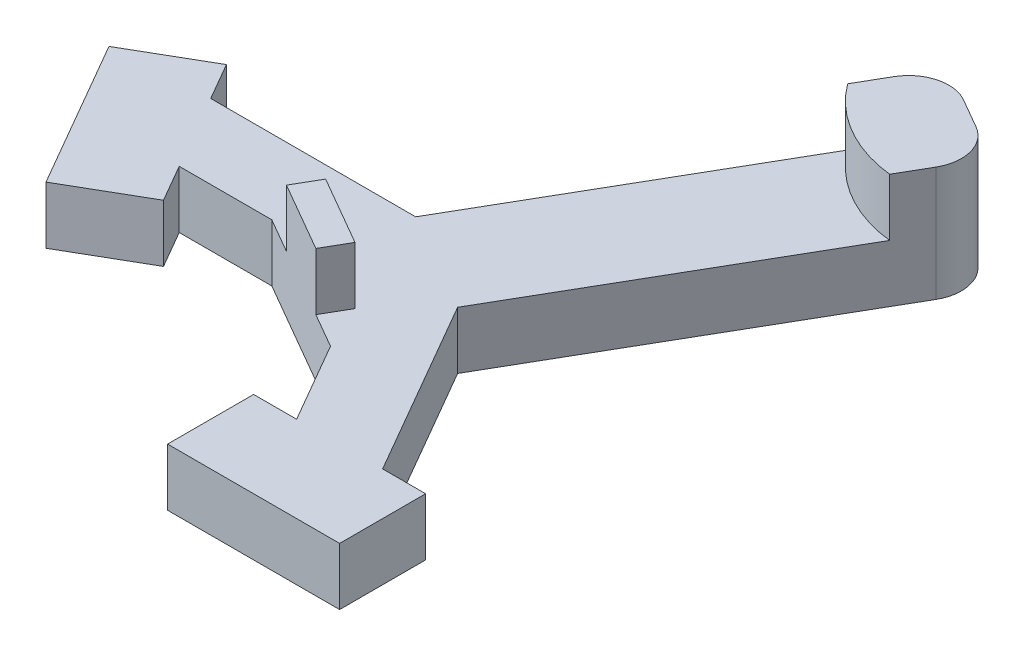
ISO-10303-21;
HEADER;
FILE_DESCRIPTION(('STEP AP214'),'2;1');
FILE_NAME('part.step','',(''),(''),'','','');
FILE_SCHEMA(('AUTOMOTIVE_DESIGN { 1 0 10303 214 1 1 1 1 }'));
ENDSEC;
DATA;
#1=APPLICATION_CONTEXT('core data for automotive mechanical design processes');
#2=APPLICATION_PROTOCOL_DEFINITION('international standard','automotive_design',2000,#1);
#3=PRODUCT_CONTEXT('',#1,'mechanical');
#4=PRODUCT('Part','Part','',(#3));
#5=PRODUCT_RELATED_PRODUCT_CATEGORY('part','',(#4));
#6=PRODUCT_DEFINITION_FORMATION('','',#4);
#7=PRODUCT_DEFINITION_CONTEXT('part definition',#1,'design');
#8=PRODUCT_DEFINITION('design','',#6,#7);
#9=PRODUCT_DEFINITION_SHAPE('','',#8);
#10=(LENGTH_UNIT() NAMED_UNIT(*) SI_UNIT(.MILLI.,.METRE.));
#11=(NAMED_UNIT(*) PLANE_ANGLE_UNIT() SI_UNIT($,.RADIAN.));
#12=(NAMED_UNIT(*) SI_UNIT($,.STERADIAN.) SOLID_ANGLE_UNIT());
#13=UNCERTAINTY_MEASURE_WITH_UNIT(LENGTH_MEASURE(1.E-05),#10,'distance_accuracy_value','');
#14=(GEOMETRIC_REPRESENTATION_CONTEXT(3) GLOBAL_UNCERTAINTY_ASSIGNED_CONTEXT((#13)) GLOBAL_UNIT_ASSIGNED_CONTEXT((#10,
#11,#12)) REPRESENTATION_CONTEXT('',''));
#15=CARTESIAN_POINT('',(0.,0.,0.));
#16=DIRECTION('',(0.,0.,1.));
#17=DIRECTION('',(1.,0.,0.));
#18=AXIS2_PLACEMENT_3D('',#15,#16,#17);
#19=CARTESIAN_POINT('',(0.,10.,0.));
#20=DIRECTION('',(0.,1.,0.));
#21=DIRECTION('',(0.,0.,1.));
#22=AXIS2_PLACEMENT_3D('',#19,#20,#21);
#23=PLANE('',#22);
#24=DIRECTION('',(-0.866025403784439,0.,-0.499999999999999));
#25=VECTOR('',#24,1.);
#26=CARTESIAN_POINT('',(40.879214965014,10.,-56.8048772929341));
#27=LINE('',#26,#25);
#28=CARTESIAN_POINT('',(40.879214965014,10.,-56.8048772929341));
#29=VERTEX_POINT('',#28);
#30=CARTESIAN_POINT('',(28.7548593120319,10.,-63.8048772929341));
#31=VERTEX_POINT('',#30);
#32=EDGE_CURVE('E494',#29,#31,#27,.T.);
#33=ORIENTED_EDGE('',*,*,#32,.F.);
#34=DIRECTION('',(0.499999999999999,0.,-0.866025403784439));
#35=VECTOR('',#34,1.);
#36=CARTESIAN_POINT('',(38.3792149650141,10.,-52.4747502740119));
#37=LINE('',#36,#35);
#38=CARTESIAN_POINT('',(38.3792149650141,10.,-52.4747502740119));
#39=VERTEX_POINT('',#38);
#40=EDGE_CURVE('E491',#39,#29,#37,.T.);
#41=ORIENTED_EDGE('',*,*,#40,.F.);
#42=DIRECTION('',(0.86602540378444,0.,0.499999999999998));
#43=VECTOR('',#42,1.);
#44=CARTESIAN_POINT('',(44.4268148554087,10.,-48.9831668493415));
#45=LINE('',#44,#43);
#46=CARTESIAN_POINT('',(44.4268148554087,10.,-48.9831668493415));
#47=VERTEX_POINT('',#46);
#48=EDGE_CURVE('E236',#39,#47,#45,.T.);
#49=ORIENTED_EDGE('',*,*,#48,.T.);
#50=DIRECTION('',(0.5,0.,0.866025403784439));
#51=VECTOR('',#50,1.);
#52=CARTESIAN_POINT('',(44.4268148554087,10.,-48.9831668493415));
#53=LINE('',#52,#51);
#54=CARTESIAN_POINT('',(52.4999999999995,10.,-35.));
#55=VERTEX_POINT('',#54);
#56=EDGE_CURVE('E275',#47,#55,#53,.T.);
#57=ORIENTED_EDGE('',*,*,#56,.T.);
#58=DIRECTION('',(-1.,0.,0.));
#59=VECTOR('',#58,1.);
#60=CARTESIAN_POINT('',(52.4999999999995,10.,-35.));
#61=LINE('',#60,#59);
#62=CARTESIAN_POINT('',(44.9999999999999,10.,-35.));
#63=VERTEX_POINT('',#62);
#64=EDGE_CURVE('E277',#55,#63,#61,.T.);
#65=ORIENTED_EDGE('',*,*,#64,.T.);
#66=DIRECTION('',(0.,0.,1.));
#67=VECTOR('',#66,1.);
#68=CARTESIAN_POINT('',(44.9999999999999,10.,-35.));
#69=LINE('',#68,#67);
#70=CARTESIAN_POINT('',(44.9999999999999,10.,-20.));
#71=VERTEX_POINT('',#70);
#72=EDGE_CURVE('E279',#63,#71,#69,.T.);
#73=ORIENTED_EDGE('',*,*,#72,.T.);
#74=DIRECTION('',(1.,0.,0.));
#75=VECTOR('',#74,1.);
#76=CARTESIAN_POINT('',(44.9999999999999,10.,-20.));
#77=LINE('',#76,#75);
#78=CARTESIAN_POINT('',(74.9999999999999,10.,-20.));
#79=VERTEX_POINT('',#78);
#80=EDGE_CURVE('E281',#71,#79,#77,.T.);
#81=ORIENTED_EDGE('',*,*,#80,.T.);
#82=DIRECTION('',(0.,0.,-1.));
#83=VECTOR('',#82,1.);
#84=CARTESIAN_POINT('',(74.9999999999999,10.,-20.));
#85=LINE('',#84,#83);
#86=CARTESIAN_POINT('',(74.9999999999999,10.,-35.));
#87=VERTEX_POINT('',#86);
#88=EDGE_CURVE('E283',#79,#87,#85,.T.);
#89=ORIENTED_EDGE('',*,*,#88,.T.);
#90=DIRECTION('',(-1.,0.,0.));
#91=VECTOR('',#90,1.);
#92=CARTESIAN_POINT('',(74.9999999999999,10.,-35.));
#93=LINE('',#92,#91);
#94=CARTESIAN_POINT('',(67.4999999999996,10.,-35.));
#95=VERTEX_POINT('',#94);
#96=EDGE_CURVE('E285',#87,#95,#93,.T.);
#97=ORIENTED_EDGE('',*,*,#96,.T.);
#98=DIRECTION('',(-0.499999999999999,0.,-0.866025403784439));
#99=VECTOR('',#98,1.);
#100=CARTESIAN_POINT('',(67.4999999999996,10.,-35.));
#101=LINE('',#100,#99);
#102=CARTESIAN_POINT('',(49.6271324027145,10.,-65.9567147554494));
#103=VERTEX_POINT('',#102);
#104=EDGE_CURVE('E287',#95,#103,#101,.T.);
#105=ORIENTED_EDGE('',*,*,#104,.T.);
#106=DIRECTION('',(0.499999999999998,0.,-0.86602540378444));
#107=VECTOR('',#106,1.);
#108=CARTESIAN_POINT('',(49.6271324027145,10.,-65.9567147554494));
#109=LINE('',#108,#107);
#110=CARTESIAN_POINT('',(77.2038148004545,10.,-113.720929772526));
#111=VERTEX_POINT('',#110);
#112=EDGE_CURVE('E289',#103,#111,#109,.T.);
#113=ORIENTED_EDGE('',*,*,#112,.T.);
#114=CARTESIAN_POINT('',(80.,10.,-138.56406460551));
#115=DIRECTION('',(0.,1.,0.));
#116=DIRECTION('',(0.,0.,1.));
#117=AXIS2_PLACEMENT_3D('',#114,#115,#116);
#118=CIRCLE('',#117,25.);
#119=CARTESIAN_POINT('',(59.8833067247658,10.,-123.720929772526));
#120=VERTEX_POINT('',#119);
#121=EDGE_CURVE('E237',#120,#111,#118,.T.);
#122=ORIENTED_EDGE('',*,*,#121,.F.);
#123=DIRECTION('',(-0.499999999999997,0.,0.86602540378444));
#124=VECTOR('',#123,1.);
#125=CARTESIAN_POINT('',(66.3397459621553,10.,-134.903810567666));
#126=LINE('',#125,#124);
#127=CARTESIAN_POINT('',(32.3066243270257,10.,-75.9567147554493));
#128=VERTEX_POINT('',#127);
#129=EDGE_CURVE('E291',#120,#128,#126,.T.);
#130=ORIENTED_EDGE('',*,*,#129,.T.);
#131=DIRECTION('',(-1.,0.,0.));
#132=VECTOR('',#131,1.);
#133=CARTESIAN_POINT('',(32.3066243270257,10.,-75.9567147554493));
#134=LINE('',#133,#132);
#135=CARTESIAN_POINT('',(-3.43911086754488,10.,-75.9567147554494));
#136=VERTEX_POINT('',#135);
#137=EDGE_CURVE('E293',#128,#136,#134,.T.);
#138=ORIENTED_EDGE('',*,*,#137,.T.);
#139=DIRECTION('',(-0.5,0.,-0.866025403784438));
#140=VECTOR('',#139,1.);
#141=CARTESIAN_POINT('',(-3.43911086754488,10.,-75.9567147554494));
#142=LINE('',#141,#140);
#143=CARTESIAN_POINT('',(-7.18911086754487,10.,-82.4519052838326));
#144=VERTEX_POINT('',#143);
#145=EDGE_CURVE('E295',#136,#144,#142,.T.);
#146=ORIENTED_EDGE('',*,*,#145,.T.);
#147=DIRECTION('',(-0.866025403784439,0.,0.5));
#148=VECTOR('',#147,1.);
#149=CARTESIAN_POINT('',(-7.18911086754487,10.,-82.4519052838326));
#150=LINE('',#149,#148);
#151=CARTESIAN_POINT('',(-20.1794919243113,10.,-74.9519052838327));
#152=VERTEX_POINT('',#151);
#153=EDGE_CURVE('E260',#144,#152,#150,.T.);
#154=ORIENTED_EDGE('',*,*,#153,.T.);
#155=DIRECTION('',(0.5,0.,0.866025403784439));
#156=VECTOR('',#155,1.);
#157=CARTESIAN_POINT('',(-20.1794919243113,10.,-74.9519052838327));
#158=LINE('',#157,#156);
#159=CARTESIAN_POINT('',(-5.17949192431135,10.,-48.9711431702996));
#160=VERTEX_POINT('',#159);
#161=EDGE_CURVE('E263',#152,#160,#158,.T.);
#162=ORIENTED_EDGE('',*,*,#161,.T.);
#163=DIRECTION('',(0.866025403784439,0.,-0.499999999999999));
#164=VECTOR('',#163,1.);
#165=CARTESIAN_POINT('',(-5.17949192431135,10.,-48.9711431702996));
#166=LINE('',#165,#164);
#167=CARTESIAN_POINT('',(7.81088913245523,10.,-56.4711431702995));
#168=VERTEX_POINT('',#167);
#169=EDGE_CURVE('E266',#160,#168,#166,.T.);
#170=ORIENTED_EDGE('',*,*,#169,.T.);
#171=DIRECTION('',(-0.500000000000015,0.,-0.86602540378443));
#172=VECTOR('',#171,1.);
#173=CARTESIAN_POINT('',(7.81088913245523,10.,-56.4711431702995));
#174=LINE('',#173,#172);
#175=CARTESIAN_POINT('',(4.06088913245512,10.,-62.9663336986828));
#176=VERTEX_POINT('',#175);
#177=EDGE_CURVE('E268',#168,#176,#174,.T.);
#178=ORIENTED_EDGE('',*,*,#177,.T.);
#179=DIRECTION('',(1.,0.,0.));
#180=VECTOR('',#179,1.);
#181=CARTESIAN_POINT('',(4.06088913245512,10.,-62.9663336986828));
#182=LINE('',#181,#180);
#183=CARTESIAN_POINT('',(20.2072594216367,10.,-62.9663336986828));
#184=VERTEX_POINT('',#183);
#185=EDGE_CURVE('E270',#176,#184,#182,.T.);
#186=ORIENTED_EDGE('',*,*,#185,.T.);
#187=CARTESIAN_POINT('',(26.2548593120319,10.,-59.4747502740119));
#188=VERTEX_POINT('',#187);
#189=EDGE_CURVE('E272',#184,#188,#45,.T.);
#190=ORIENTED_EDGE('',*,*,#189,.T.);
#191=DIRECTION('',(-0.5,0.,0.866025403784439));
#192=VECTOR('',#191,1.);
#193=CARTESIAN_POINT('',(28.7548593120319,10.,-63.8048772929341));
#194=LINE('',#193,#192);
#195=EDGE_CURVE('E231',#31,#188,#194,.T.);
#196=ORIENTED_EDGE('',*,*,#195,.F.);
#197=EDGE_LOOP('',(#33,#41,#49,#57,#65,#73,#81,#89,#97,#105,#113,#122,#130,#138,#146,#154,#162,
#170,#178,#186,#190,#196));
#198=FACE_BOUND('',#197,.T.);
#199=ADVANCED_FACE('F37',(#198),#23,.T.);
#200=CARTESIAN_POINT('',(-7.18911086754487,10.,-82.4519052838326));
#201=DIRECTION('',(0.5,0.,0.866025403784439));
#202=DIRECTION('',(0.866025403784439,0.,-0.5));
#203=AXIS2_PLACEMENT_3D('',#200,#201,#202);
#204=PLANE('',#203);
#205=DIRECTION('',(-0.866025403784439,0.,0.5));
#206=VECTOR('',#205,1.);
#207=CARTESIAN_POINT('',(-7.18911086754487,0.,-82.4519052838326));
#208=LINE('',#207,#206);
#209=CARTESIAN_POINT('',(-7.18911086754487,0.,-82.4519052838326));
#210=VERTEX_POINT('',#209);
#211=CARTESIAN_POINT('',(-20.1794919243113,0.,-74.9519052838327));
#212=VERTEX_POINT('',#211);
#213=EDGE_CURVE('E259',#210,#212,#208,.T.);
#214=ORIENTED_EDGE('',*,*,#213,.T.);
#215=DIRECTION('',(0.,-1.,0.));
#216=VECTOR('',#215,1.);
#217=CARTESIAN_POINT('',(-20.1794919243113,10.,-74.9519052838327));
#218=LINE('',#217,#216);
#219=EDGE_CURVE('E377',#152,#212,#218,.T.);
#220=ORIENTED_EDGE('',*,*,#219,.F.);
#221=ORIENTED_EDGE('',*,*,#153,.F.);
#222=DIRECTION('',(0.,-1.,0.));
#223=VECTOR('',#222,1.);
#224=CARTESIAN_POINT('',(-7.18911086754487,10.,-82.4519052838326));
#225=LINE('',#224,#223);
#226=EDGE_CURVE('E297',#144,#210,#225,.T.);
#227=ORIENTED_EDGE('',*,*,#226,.T.);
#228=EDGE_LOOP('',(#214,#220,#221,#227));
#229=FACE_BOUND('',#228,.T.);
#230=ADVANCED_FACE('F475',(#229),#204,.F.);
#231=CARTESIAN_POINT('',(-20.1794919243113,10.,-74.9519052838327));
#232=DIRECTION('',(0.866025403784438,0.,-0.5));
#233=DIRECTION('',(-0.5,0.,-0.866025403784439));
#234=AXIS2_PLACEMENT_3D('',#231,#232,#233);
#235=PLANE('',#234);
#236=DIRECTION('',(0.5,0.,0.866025403784439));
#237=VECTOR('',#236,1.);
#238=CARTESIAN_POINT('',(-20.1794919243113,0.,-74.9519052838327));
#239=LINE('',#238,#237);
#240=CARTESIAN_POINT('',(-5.17949192431135,0.,-48.9711431702996));
#241=VERTEX_POINT('',#240);
#242=EDGE_CURVE('E300',#212,#241,#239,.T.);
#243=ORIENTED_EDGE('',*,*,#242,.T.);
#244=DIRECTION('',(0.,-1.,0.));
#245=VECTOR('',#244,1.);
#246=CARTESIAN_POINT('',(-5.17949192431135,10.,-48.9711431702996));
#247=LINE('',#246,#245);
#248=EDGE_CURVE('E374',#160,#241,#247,.T.);
#249=ORIENTED_EDGE('',*,*,#248,.F.);
#250=ORIENTED_EDGE('',*,*,#161,.F.);
#251=ORIENTED_EDGE('',*,*,#219,.T.);
#252=EDGE_LOOP('',(#243,#249,#250,#251));
#253=FACE_BOUND('',#252,.T.);
#254=ADVANCED_FACE('F471',(#253),#235,.F.);
#255=CARTESIAN_POINT('',(-5.17949192431135,10.,-48.9711431702996));
#256=DIRECTION('',(-0.5,0.,-0.866025403784439));
#257=DIRECTION('',(-0.866025403784439,0.,0.5));
#258=AXIS2_PLACEMENT_3D('',#255,#256,#257);
#259=PLANE('',#258);
#260=DIRECTION('',(0.866025403784439,0.,-0.499999999999999));
#261=VECTOR('',#260,1.);
#262=CARTESIAN_POINT('',(-5.17949192431135,0.,-48.9711431702996));
#263=LINE('',#262,#261);
#264=CARTESIAN_POINT('',(7.81088913245523,0.,-56.4711431702995));
#265=VERTEX_POINT('',#264);
#266=EDGE_CURVE('E302',#241,#265,#263,.T.);
#267=ORIENTED_EDGE('',*,*,#266,.T.);
#268=DIRECTION('',(0.,-1.,0.));
#269=VECTOR('',#268,1.);
#270=CARTESIAN_POINT('',(7.81088913245523,10.,-56.4711431702995));
#271=LINE('',#270,#269);
#272=EDGE_CURVE('E371',#168,#265,#271,.T.);
#273=ORIENTED_EDGE('',*,*,#272,.F.);
#274=ORIENTED_EDGE('',*,*,#169,.F.);
#275=ORIENTED_EDGE('',*,*,#248,.T.);
#276=EDGE_LOOP('',(#267,#273,#274,#275));
#277=FACE_BOUND('',#276,.T.);
#278=ADVANCED_FACE('F467',(#277),#259,.F.);
#279=CARTESIAN_POINT('',(7.81088913245523,10.,-56.4711431702995));
#280=DIRECTION('',(-0.86602540378443,0.,0.500000000000015));
#281=DIRECTION('',(0.500000000000015,0.,0.86602540378443));
#282=AXIS2_PLACEMENT_3D('',#279,#280,#281);
#283=PLANE('',#282);
#284=DIRECTION('',(-0.500000000000015,0.,-0.86602540378443));
#285=VECTOR('',#284,1.);
#286=CARTESIAN_POINT('',(7.81088913245523,0.,-56.4711431702995));
#287=LINE('',#286,#285);
#288=CARTESIAN_POINT('',(4.06088913245512,0.,-62.9663336986828));
#289=VERTEX_POINT('',#288);
#290=EDGE_CURVE('E304',#265,#289,#287,.T.);
#291=ORIENTED_EDGE('',*,*,#290,.T.);
#292=DIRECTION('',(0.,-1.,0.));
#293=VECTOR('',#292,1.);
#294=CARTESIAN_POINT('',(4.06088913245512,10.,-62.9663336986828));
#295=LINE('',#294,#293);
#296=EDGE_CURVE('E368',#176,#289,#295,.T.);
#297=ORIENTED_EDGE('',*,*,#296,.F.);
#298=ORIENTED_EDGE('',*,*,#177,.F.);
#299=ORIENTED_EDGE('',*,*,#272,.T.);
#300=EDGE_LOOP('',(#291,#297,#298,#299));
#301=FACE_BOUND('',#300,.T.);
#302=ADVANCED_FACE('F462',(#301),#283,.F.);
#303=CARTESIAN_POINT('',(4.06088913245512,10.,-62.9663336986828));
#304=DIRECTION('',(0.,0.,-1.));
#305=DIRECTION('',(-1.,0.,0.));
#306=AXIS2_PLACEMENT_3D('',#303,#304,#305);
#307=PLANE('',#306);
#308=DIRECTION('',(1.,0.,0.));
#309=VECTOR('',#308,1.);
#310=CARTESIAN_POINT('',(4.06088913245512,0.,-62.9663336986828));
#311=LINE('',#310,#309);
#312=CARTESIAN_POINT('',(20.2072594216367,0.,-62.9663336986828));
#313=VERTEX_POINT('',#312);
#314=EDGE_CURVE('E306',#289,#313,#311,.T.);
#315=ORIENTED_EDGE('',*,*,#314,.T.);
#316=DIRECTION('',(0.,-1.,0.));
#317=VECTOR('',#316,1.);
#318=CARTESIAN_POINT('',(20.2072594216367,10.,-62.9663336986828));
#319=LINE('',#318,#317);
#320=EDGE_CURVE('E365',#184,#313,#319,.T.);
#321=ORIENTED_EDGE('',*,*,#320,.F.);
#322=ORIENTED_EDGE('',*,*,#185,.F.);
#323=ORIENTED_EDGE('',*,*,#296,.T.);
#324=EDGE_LOOP('',(#315,#321,#322,#323));
#325=FACE_BOUND('',#324,.T.);
#326=ADVANCED_FACE('F458',(#325),#307,.F.);
#327=CARTESIAN_POINT('',(44.4268148554087,10.,-48.9831668493415));
#328=DIRECTION('',(0.499999999999998,0.,-0.86602540378444));
#329=DIRECTION('',(-0.86602540378444,0.,-0.499999999999998));
#330=AXIS2_PLACEMENT_3D('',#327,#328,#329);
#331=PLANE('',#330);
#332=DIRECTION('',(0.86602540378444,0.,0.499999999999998));
#333=VECTOR('',#332,1.);
#334=CARTESIAN_POINT('',(44.4268148554087,0.,-48.9831668493415));
#335=LINE('',#334,#333);
#336=CARTESIAN_POINT('',(44.4268148554087,0.,-48.9831668493415));
#337=VERTEX_POINT('',#336);
#338=EDGE_CURVE('E308',#313,#337,#335,.T.);
#339=ORIENTED_EDGE('',*,*,#338,.T.);
#340=DIRECTION('',(0.,-1.,0.));
#341=VECTOR('',#340,1.);
#342=CARTESIAN_POINT('',(44.4268148554087,10.,-48.9831668493415));
#343=LINE('',#342,#341);
#344=EDGE_CURVE('E362',#47,#337,#343,.T.);
#345=ORIENTED_EDGE('',*,*,#344,.F.);
#346=ORIENTED_EDGE('',*,*,#48,.F.);
#347=DIRECTION('',(0.,-1.,0.));
#348=VECTOR('',#347,1.);
#349=CARTESIAN_POINT('',(38.3792149650141,20.,-52.4747502740119));
#350=LINE('',#349,#348);
#351=CARTESIAN_POINT('',(38.3792149650141,20.,-52.4747502740119));
#352=VERTEX_POINT('',#351);
#353=EDGE_CURVE('E215',#352,#39,#350,.T.);
#354=ORIENTED_EDGE('',*,*,#353,.F.);
#355=DIRECTION('',(0.866025403784439,0.,0.5));
#356=VECTOR('',#355,1.);
#357=CARTESIAN_POINT('',(26.2548593120319,20.,-59.4747502740119));
#358=LINE('',#357,#356);
#359=CARTESIAN_POINT('',(26.2548593120319,20.,-59.4747502740119));
#360=VERTEX_POINT('',#359);
#361=EDGE_CURVE('E222',#360,#352,#358,.T.);
#362=ORIENTED_EDGE('',*,*,#361,.F.);
#363=DIRECTION('',(0.,-1.,0.));
#364=VECTOR('',#363,1.);
#365=CARTESIAN_POINT('',(26.2548593120319,20.,-59.4747502740119));
#366=LINE('',#365,#364);
#367=EDGE_CURVE('E501',#360,#188,#366,.T.);
#368=ORIENTED_EDGE('',*,*,#367,.T.);
#369=ORIENTED_EDGE('',*,*,#189,.F.);
#370=ORIENTED_EDGE('',*,*,#320,.T.);
#371=EDGE_LOOP('',(#339,#345,#346,#354,#362,#368,#369,#370));
#372=FACE_BOUND('',#371,.T.);
#373=ADVANCED_FACE('F234',(#372),#331,.F.);
#374=CARTESIAN_POINT('',(44.4268148554087,10.,-48.9831668493415));
#375=DIRECTION('',(0.866025403784439,0.,-0.5));
#376=DIRECTION('',(-0.5,0.,-0.866025403784439));
#377=AXIS2_PLACEMENT_3D('',#374,#375,#376);
#378=PLANE('',#377);
#379=DIRECTION('',(0.5,0.,0.866025403784439));
#380=VECTOR('',#379,1.);
#381=CARTESIAN_POINT('',(44.4268148554087,0.,-48.9831668493415));
#382=LINE('',#381,#380);
#383=CARTESIAN_POINT('',(52.4999999999995,0.,-35.));
#384=VERTEX_POINT('',#383);
#385=EDGE_CURVE('E310',#337,#384,#382,.T.);
#386=ORIENTED_EDGE('',*,*,#385,.T.);
#387=DIRECTION('',(0.,-1.,0.));
#388=VECTOR('',#387,1.);
#389=CARTESIAN_POINT('',(52.4999999999995,10.,-35.));
#390=LINE('',#389,#388);
#391=EDGE_CURVE('E359',#55,#384,#390,.T.);
#392=ORIENTED_EDGE('',*,*,#391,.F.);
#393=ORIENTED_EDGE('',*,*,#56,.F.);
#394=ORIENTED_EDGE('',*,*,#344,.T.);
#395=EDGE_LOOP('',(#386,#392,#393,#394));
#396=FACE_BOUND('',#395,.T.);
#397=ADVANCED_FACE('F450',(#396),#378,.F.);
#398=CARTESIAN_POINT('',(52.4999999999995,10.,-35.));
#399=DIRECTION('',(0.,0.,1.));
#400=DIRECTION('',(1.,0.,0.));
#401=AXIS2_PLACEMENT_3D('',#398,#399,#400);
#402=PLANE('',#401);
#403=DIRECTION('',(-1.,0.,0.));
#404=VECTOR('',#403,1.);
#405=CARTESIAN_POINT('',(52.4999999999995,0.,-35.));
#406=LINE('',#405,#404);
#407=CARTESIAN_POINT('',(44.9999999999999,0.,-35.));
#408=VERTEX_POINT('',#407);
#409=EDGE_CURVE('E312',#384,#408,#406,.T.);
#410=ORIENTED_EDGE('',*,*,#409,.T.);
#411=DIRECTION('',(0.,-1.,0.));
#412=VECTOR('',#411,1.);
#413=CARTESIAN_POINT('',(44.9999999999999,10.,-35.));
#414=LINE('',#413,#412);
#415=EDGE_CURVE('E356',#63,#408,#414,.T.);
#416=ORIENTED_EDGE('',*,*,#415,.F.);
#417=ORIENTED_EDGE('',*,*,#64,.F.);
#418=ORIENTED_EDGE('',*,*,#391,.T.);
#419=EDGE_LOOP('',(#410,#416,#417,#418));
#420=FACE_BOUND('',#419,.T.);
#421=ADVANCED_FACE('F446',(#420),#402,.F.);
#422=CARTESIAN_POINT('',(44.9999999999999,10.,-35.));
#423=DIRECTION('',(1.,0.,0.));
#424=DIRECTION('',(0.,0.,-1.));
#425=AXIS2_PLACEMENT_3D('',#422,#423,#424);
#426=PLANE('',#425);
#427=DIRECTION('',(0.,0.,1.));
#428=VECTOR('',#427,1.);
#429=CARTESIAN_POINT('',(44.9999999999999,0.,-35.));
#430=LINE('',#429,#428);
#431=CARTESIAN_POINT('',(44.9999999999999,0.,-20.));
#432=VERTEX_POINT('',#431);
#433=EDGE_CURVE('E314',#408,#432,#430,.T.);
#434=ORIENTED_EDGE('',*,*,#433,.T.);
#435=DIRECTION('',(0.,-1.,0.));
#436=VECTOR('',#435,1.);
#437=CARTESIAN_POINT('',(44.9999999999999,10.,-20.));
#438=LINE('',#437,#436);
#439=EDGE_CURVE('E353',#71,#432,#438,.T.);
#440=ORIENTED_EDGE('',*,*,#439,.F.);
#441=ORIENTED_EDGE('',*,*,#72,.F.);
#442=ORIENTED_EDGE('',*,*,#415,.T.);
#443=EDGE_LOOP('',(#434,#440,#441,#442));
#444=FACE_BOUND('',#443,.T.);
#445=ADVANCED_FACE('F441',(#444),#426,.F.);
#446=CARTESIAN_POINT('',(44.9999999999999,10.,-20.));
#447=DIRECTION('',(0.,0.,-1.));
#448=DIRECTION('',(-1.,0.,0.));
#449=AXIS2_PLACEMENT_3D('',#446,#447,#448);
#450=PLANE('',#449);
#451=DIRECTION('',(1.,0.,0.));
#452=VECTOR('',#451,1.);
#453=CARTESIAN_POINT('',(44.9999999999999,0.,-20.));
#454=LINE('',#453,#452);
#455=CARTESIAN_POINT('',(74.9999999999999,0.,-20.));
#456=VERTEX_POINT('',#455);
#457=EDGE_CURVE('E316',#432,#456,#454,.T.);
#458=ORIENTED_EDGE('',*,*,#457,.T.);
#459=DIRECTION('',(0.,-1.,0.));
#460=VECTOR('',#459,1.);
#461=CARTESIAN_POINT('',(74.9999999999999,10.,-20.));
#462=LINE('',#461,#460);
#463=EDGE_CURVE('E350',#79,#456,#462,.T.);
#464=ORIENTED_EDGE('',*,*,#463,.F.);
#465=ORIENTED_EDGE('',*,*,#80,.F.);
#466=ORIENTED_EDGE('',*,*,#439,.T.);
#467=EDGE_LOOP('',(#458,#464,#465,#466));
#468=FACE_BOUND('',#467,.T.);
#469=ADVANCED_FACE('F435',(#468),#450,.F.);
#470=CARTESIAN_POINT('',(74.9999999999999,10.,-20.));
#471=DIRECTION('',(-1.,0.,0.));
#472=DIRECTION('',(0.,0.,1.));
#473=AXIS2_PLACEMENT_3D('',#470,#471,#472);
#474=PLANE('',#473);
#475=DIRECTION('',(0.,0.,-1.));
#476=VECTOR('',#475,1.);
#477=CARTESIAN_POINT('',(74.9999999999999,0.,-20.));
#478=LINE('',#477,#476);
#479=CARTESIAN_POINT('',(74.9999999999999,0.,-35.));
#480=VERTEX_POINT('',#479);
#481=EDGE_CURVE('E318',#456,#480,#478,.T.);
#482=ORIENTED_EDGE('',*,*,#481,.T.);
#483=DIRECTION('',(0.,-1.,0.));
#484=VECTOR('',#483,1.);
#485=CARTESIAN_POINT('',(74.9999999999999,10.,-35.));
#486=LINE('',#485,#484);
#487=EDGE_CURVE('E347',#87,#480,#486,.T.);
#488=ORIENTED_EDGE('',*,*,#487,.F.);
#489=ORIENTED_EDGE('',*,*,#88,.F.);
#490=ORIENTED_EDGE('',*,*,#463,.T.);
#491=EDGE_LOOP('',(#482,#488,#489,#490));
#492=FACE_BOUND('',#491,.T.);
#493=ADVANCED_FACE('F431',(#492),#474,.F.);
#494=CARTESIAN_POINT('',(74.9999999999999,10.,-35.));
#495=DIRECTION('',(0.,0.,1.));
#496=DIRECTION('',(1.,0.,0.));
#497=AXIS2_PLACEMENT_3D('',#494,#495,#496);
#498=PLANE('',#497);
#499=DIRECTION('',(-1.,0.,0.));
#500=VECTOR('',#499,1.);
#501=CARTESIAN_POINT('',(74.9999999999999,0.,-35.));
#502=LINE('',#501,#500);
#503=CARTESIAN_POINT('',(67.4999999999996,0.,-35.));
#504=VERTEX_POINT('',#503);
#505=EDGE_CURVE('E320',#480,#504,#502,.T.);
#506=ORIENTED_EDGE('',*,*,#505,.T.);
#507=DIRECTION('',(0.,-1.,0.));
#508=VECTOR('',#507,1.);
#509=CARTESIAN_POINT('',(67.4999999999996,10.,-35.));
#510=LINE('',#509,#508);
#511=EDGE_CURVE('E344',#95,#504,#510,.T.);
#512=ORIENTED_EDGE('',*,*,#511,.F.);
#513=ORIENTED_EDGE('',*,*,#96,.F.);
#514=ORIENTED_EDGE('',*,*,#487,.T.);
#515=EDGE_LOOP('',(#506,#512,#513,#514));
#516=FACE_BOUND('',#515,.T.);
#517=ADVANCED_FACE('F426',(#516),#498,.F.);
#518=CARTESIAN_POINT('',(67.4999999999996,10.,-35.));
#519=DIRECTION('',(-0.866025403784439,0.,0.499999999999999));
#520=DIRECTION('',(0.499999999999999,0.,0.866025403784439));
#521=AXIS2_PLACEMENT_3D('',#518,#519,#520);
#522=PLANE('',#521);
#523=DIRECTION('',(-0.499999999999999,0.,-0.866025403784439));
#524=VECTOR('',#523,1.);
#525=CARTESIAN_POINT('',(67.4999999999996,0.,-35.));
#526=LINE('',#525,#524);
#527=CARTESIAN_POINT('',(49.6271324027145,0.,-65.9567147554494));
#528=VERTEX_POINT('',#527);
#529=EDGE_CURVE('E322',#504,#528,#526,.T.);
#530=ORIENTED_EDGE('',*,*,#529,.T.);
#531=DIRECTION('',(0.,-1.,0.));
#532=VECTOR('',#531,1.);
#533=CARTESIAN_POINT('',(49.6271324027145,10.,-65.9567147554494));
#534=LINE('',#533,#532);
#535=EDGE_CURVE('E341',#103,#528,#534,.T.);
#536=ORIENTED_EDGE('',*,*,#535,.F.);
#537=ORIENTED_EDGE('',*,*,#104,.F.);
#538=ORIENTED_EDGE('',*,*,#511,.T.);
#539=EDGE_LOOP('',(#530,#536,#537,#538));
#540=FACE_BOUND('',#539,.T.);
#541=ADVANCED_FACE('F420',(#540),#522,.F.);
#542=CARTESIAN_POINT('',(49.6271324027145,10.,-65.9567147554494));
#543=DIRECTION('',(-0.86602540378444,0.,-0.499999999999998));
#544=DIRECTION('',(-0.499999999999998,0.,0.86602540378444));
#545=AXIS2_PLACEMENT_3D('',#542,#543,#544);
#546=PLANE('',#545);
#547=DIRECTION('',(0.499999999999998,0.,-0.86602540378444));
#548=VECTOR('',#547,1.);
#549=CARTESIAN_POINT('',(49.6271324027145,0.,-65.9567147554494));
#550=LINE('',#549,#548);
#551=CARTESIAN_POINT('',(80.1602540378442,0.,-118.841632741175));
#552=VERTEX_POINT('',#551);
#553=EDGE_CURVE('E324',#528,#552,#550,.T.);
#554=ORIENTED_EDGE('',*,*,#553,.T.);
#555=DIRECTION('',(0.,-1.,0.));
#556=VECTOR('',#555,1.);
#557=CARTESIAN_POINT('',(80.1602540378442,10.,-118.841632741175));
#558=LINE('',#557,#556);
#559=CARTESIAN_POINT('',(80.1602540378442,20.,-118.841632741175));
#560=VERTEX_POINT('',#559);
#561=EDGE_CURVE('E11',#552,#560,#558,.F.);
#562=ORIENTED_EDGE('',*,*,#561,.T.);
#563=DIRECTION('',(0.499999999999997,0.,-0.86602540378444));
#564=VECTOR('',#563,1.);
#565=CARTESIAN_POINT('',(83.6602540378442,20.,-124.903810567666));
#566=LINE('',#565,#564);
#567=CARTESIAN_POINT('',(77.2038148004545,20.,-113.720929772526));
#568=VERTEX_POINT('',#567);
#569=EDGE_CURVE('E251',#568,#560,#566,.T.);
#570=ORIENTED_EDGE('',*,*,#569,.F.);
#571=DIRECTION('',(0.,-1.,0.));
#572=VECTOR('',#571,1.);
#573=CARTESIAN_POINT('',(77.2038148004545,20.,-113.720929772526));
#574=LINE('',#573,#572);
#575=EDGE_CURVE('E252',#568,#111,#574,.T.);
#576=ORIENTED_EDGE('',*,*,#575,.T.);
#577=ORIENTED_EDGE('',*,*,#112,.F.);
#578=ORIENTED_EDGE('',*,*,#535,.T.);
#579=EDGE_LOOP('',(#554,#562,#570,#576,#577,#578));
#580=FACE_BOUND('',#579,.T.);
#581=ADVANCED_FACE('F415',(#580),#546,.F.);
#582=CARTESIAN_POINT('',(83.6602540378442,10.,-124.903810567666));
#583=DIRECTION('',(-0.499999999999997,0.,0.86602540378444));
#584=DIRECTION('',(0.86602540378444,0.,0.499999999999997));
#585=AXIS2_PLACEMENT_3D('',#582,#583,#584);
#586=PLANE('',#585);
#587=DIRECTION('',(-0.86602540378444,0.,-0.499999999999997));
#588=VECTOR('',#587,1.);
#589=CARTESIAN_POINT('',(83.6602540378442,0.,-124.903810567666));
#590=LINE('',#589,#588);
#591=CARTESIAN_POINT('',(77.5980762113531,0.,-128.403810567666));
#592=VERTEX_POINT('',#591);
#593=CARTESIAN_POINT('',(72.4019237886464,0.,-131.403810567666));
#594=VERTEX_POINT('',#593);
#595=EDGE_CURVE('E326',#592,#594,#590,.T.);
#596=ORIENTED_EDGE('',*,*,#595,.T.);
#597=DIRECTION('',(0.,-1.,0.));
#598=VECTOR('',#597,1.);
#599=CARTESIAN_POINT('',(72.4019237886464,10.,-131.403810567666));
#600=LINE('',#599,#598);
#601=CARTESIAN_POINT('',(72.4019237886464,20.,-131.403810567666));
#602=VERTEX_POINT('',#601);
#603=EDGE_CURVE('E58',#594,#602,#600,.F.);
#604=ORIENTED_EDGE('',*,*,#603,.T.);
#605=DIRECTION('',(-0.86602540378444,0.,-0.499999999999997));
#606=VECTOR('',#605,1.);
#607=CARTESIAN_POINT('',(66.3397459621553,20.,-134.903810567666));
#608=LINE('',#607,#606);
#609=CARTESIAN_POINT('',(77.5980762113531,20.,-128.403810567666));
#610=VERTEX_POINT('',#609);
#611=EDGE_CURVE('E240',#610,#602,#608,.T.);
#612=ORIENTED_EDGE('',*,*,#611,.F.);
#613=DIRECTION('',(0.,-1.,0.));
#614=VECTOR('',#613,1.);
#615=CARTESIAN_POINT('',(77.5980762113531,10.,-128.403810567666));
#616=LINE('',#615,#614);
#617=EDGE_CURVE('E387',#610,#592,#616,.T.);
#618=ORIENTED_EDGE('',*,*,#617,.T.);
#619=EDGE_LOOP('',(#596,#604,#612,#618));
#620=FACE_BOUND('',#619,.T.);
#621=ADVANCED_FACE('F409',(#620),#586,.F.);
#622=CARTESIAN_POINT('',(66.3397459621553,10.,-134.903810567666));
#623=DIRECTION('',(0.86602540378444,0.,0.499999999999997));
#624=DIRECTION('',(0.499999999999997,0.,-0.86602540378444));
#625=AXIS2_PLACEMENT_3D('',#622,#623,#624);
#626=PLANE('',#625);
#627=DIRECTION('',(-0.499999999999997,0.,0.86602540378444));
#628=VECTOR('',#627,1.);
#629=CARTESIAN_POINT('',(66.3397459621553,20.,-134.903810567666));
#630=LINE('',#629,#628);
#631=CARTESIAN_POINT('',(62.8397459621554,20.,-128.841632741175));
#632=VERTEX_POINT('',#631);
#633=CARTESIAN_POINT('',(59.8833067247658,20.,-123.720929772526));
#634=VERTEX_POINT('',#633);
#635=EDGE_CURVE('E247',#632,#634,#630,.T.);
#636=ORIENTED_EDGE('',*,*,#635,.F.);
#637=DIRECTION('',(0.,-1.,0.));
#638=VECTOR('',#637,1.);
#639=CARTESIAN_POINT('',(62.8397459621554,10.,-128.841632741175));
#640=LINE('',#639,#638);
#641=CARTESIAN_POINT('',(62.8397459621554,0.,-128.841632741175));
#642=VERTEX_POINT('',#641);
#643=EDGE_CURVE('E380',#632,#642,#640,.T.);
#644=ORIENTED_EDGE('',*,*,#643,.T.);
#645=DIRECTION('',(-0.499999999999997,0.,0.86602540378444));
#646=VECTOR('',#645,1.);
#647=CARTESIAN_POINT('',(66.3397459621553,0.,-134.903810567666));
#648=LINE('',#647,#646);
#649=CARTESIAN_POINT('',(32.3066243270257,0.,-75.9567147554493));
#650=VERTEX_POINT('',#649);
#651=EDGE_CURVE('E328',#642,#650,#648,.T.);
#652=ORIENTED_EDGE('',*,*,#651,.T.);
#653=DIRECTION('',(0.,-1.,0.));
#654=VECTOR('',#653,1.);
#655=CARTESIAN_POINT('',(32.3066243270257,10.,-75.9567147554493));
#656=LINE('',#655,#654);
#657=EDGE_CURVE('E338',#128,#650,#656,.T.);
#658=ORIENTED_EDGE('',*,*,#657,.F.);
#659=ORIENTED_EDGE('',*,*,#129,.F.);
#660=DIRECTION('',(0.,-1.,0.));
#661=VECTOR('',#660,1.);
#662=CARTESIAN_POINT('',(59.8833067247658,20.,-123.720929772526));
#663=LINE('',#662,#661);
#664=EDGE_CURVE('E256',#634,#120,#663,.T.);
#665=ORIENTED_EDGE('',*,*,#664,.F.);
#666=EDGE_LOOP('',(#636,#644,#652,#658,#659,#665));
#667=FACE_BOUND('',#666,.T.);
#668=ADVANCED_FACE('F400',(#667),#626,.F.);
#669=CARTESIAN_POINT('',(32.3066243270257,10.,-75.9567147554493));
#670=DIRECTION('',(0.,0.,1.));
#671=DIRECTION('',(1.,0.,0.));
#672=AXIS2_PLACEMENT_3D('',#669,#670,#671);
#673=PLANE('',#672);
#674=DIRECTION('',(-1.,0.,0.));
#675=VECTOR('',#674,1.);
#676=CARTESIAN_POINT('',(32.3066243270257,0.,-75.9567147554493));
#677=LINE('',#676,#675);
#678=CARTESIAN_POINT('',(-3.43911086754488,0.,-75.9567147554494));
#679=VERTEX_POINT('',#678);
#680=EDGE_CURVE('E330',#650,#679,#677,.T.);
#681=ORIENTED_EDGE('',*,*,#680,.T.);
#682=DIRECTION('',(0.,-1.,0.));
#683=VECTOR('',#682,1.);
#684=CARTESIAN_POINT('',(-3.43911086754488,10.,-75.9567147554494));
#685=LINE('',#684,#683);
#686=EDGE_CURVE('E335',#136,#679,#685,.T.);
#687=ORIENTED_EDGE('',*,*,#686,.F.);
#688=ORIENTED_EDGE('',*,*,#137,.F.);
#689=ORIENTED_EDGE('',*,*,#657,.T.);
#690=EDGE_LOOP('',(#681,#687,#688,#689));
#691=FACE_BOUND('',#690,.T.);
#692=ADVANCED_FACE('F484',(#691),#673,.F.);
#693=CARTESIAN_POINT('',(-3.43911086754488,10.,-75.9567147554494));
#694=DIRECTION('',(-0.866025403784438,0.,0.5));
#695=DIRECTION('',(0.5,0.,0.866025403784438));
#696=AXIS2_PLACEMENT_3D('',#693,#694,#695);
#697=PLANE('',#696);
#698=DIRECTION('',(-0.5,0.,-0.866025403784438));
#699=VECTOR('',#698,1.);
#700=CARTESIAN_POINT('',(-3.43911086754488,0.,-75.9567147554494));
#701=LINE('',#700,#699);
#702=EDGE_CURVE('E264',#679,#210,#701,.T.);
#703=ORIENTED_EDGE('',*,*,#702,.T.);
#704=ORIENTED_EDGE('',*,*,#226,.F.);
#705=ORIENTED_EDGE('',*,*,#145,.F.);
#706=ORIENTED_EDGE('',*,*,#686,.T.);
#707=EDGE_LOOP('',(#703,#704,#705,#706));
#708=FACE_BOUND('',#707,.T.);
#709=ADVANCED_FACE('F479',(#708),#697,.F.);
#710=CARTESIAN_POINT('',(0.,0.,0.));
#711=DIRECTION('',(0.,1.,0.));
#712=DIRECTION('',(0.,0.,1.));
#713=AXIS2_PLACEMENT_3D('',#710,#711,#712);
#714=PLANE('',#713);
#715=ORIENTED_EDGE('',*,*,#651,.F.);
#716=CARTESIAN_POINT('',(68.9019237886464,0.,-125.341632741175));
#717=DIRECTION('',(0.,1.,0.));
#718=DIRECTION('',(0.,0.,1.));
#719=AXIS2_PLACEMENT_3D('',#716,#717,#718);
#720=CIRCLE('',#719,7.);
#721=EDGE_CURVE('E385',#642,#594,#720,.F.);
#722=ORIENTED_EDGE('',*,*,#721,.T.);
#723=ORIENTED_EDGE('',*,*,#595,.F.);
#724=CARTESIAN_POINT('',(74.0980762113531,0.,-122.341632741175));
#725=DIRECTION('',(0.,1.,0.));
#726=DIRECTION('',(0.,0.,1.));
#727=AXIS2_PLACEMENT_3D('',#724,#725,#726);
#728=CIRCLE('',#727,7.);
#729=EDGE_CURVE('E383',#592,#552,#728,.F.);
#730=ORIENTED_EDGE('',*,*,#729,.T.);
#731=ORIENTED_EDGE('',*,*,#553,.F.);
#732=ORIENTED_EDGE('',*,*,#529,.F.);
#733=ORIENTED_EDGE('',*,*,#505,.F.);
#734=ORIENTED_EDGE('',*,*,#481,.F.);
#735=ORIENTED_EDGE('',*,*,#457,.F.);
#736=ORIENTED_EDGE('',*,*,#433,.F.);
#737=ORIENTED_EDGE('',*,*,#409,.F.);
#738=ORIENTED_EDGE('',*,*,#385,.F.);
#739=ORIENTED_EDGE('',*,*,#338,.F.);
#740=ORIENTED_EDGE('',*,*,#314,.F.);
#741=ORIENTED_EDGE('',*,*,#290,.F.);
#742=ORIENTED_EDGE('',*,*,#266,.F.);
#743=ORIENTED_EDGE('',*,*,#242,.F.);
#744=ORIENTED_EDGE('',*,*,#213,.F.);
#745=ORIENTED_EDGE('',*,*,#702,.F.);
#746=ORIENTED_EDGE('',*,*,#680,.F.);
#747=EDGE_LOOP('',(#715,#722,#723,#730,#731,#732,#733,#734,#735,#736,#737,#738,#739,#740,#741,
#742,#743,#744,#745,#746));
#748=FACE_BOUND('',#747,.T.);
#749=ADVANCED_FACE('F407',(#748),#714,.F.);
#750=CARTESIAN_POINT('',(80.,20.,-138.56406460551));
#751=DIRECTION('',(0.,-1.,0.));
#752=DIRECTION('',(0.,0.,-1.));
#753=AXIS2_PLACEMENT_3D('',#750,#751,#752);
#754=CYLINDRICAL_SURFACE('',#753,25.);
#755=ORIENTED_EDGE('',*,*,#121,.T.);
#756=ORIENTED_EDGE('',*,*,#575,.F.);
#757=CARTESIAN_POINT('',(80.,20.,-138.56406460551));
#758=DIRECTION('',(0.,1.,0.));
#759=DIRECTION('',(0.,0.,1.));
#760=AXIS2_PLACEMENT_3D('',#757,#758,#759);
#761=CIRCLE('',#760,25.);
#762=EDGE_CURVE('E249',#634,#568,#761,.T.);
#763=ORIENTED_EDGE('',*,*,#762,.F.);
#764=ORIENTED_EDGE('',*,*,#664,.T.);
#765=EDGE_LOOP('',(#755,#756,#763,#764));
#766=FACE_BOUND('',#765,.T.);
#767=ADVANCED_FACE('F488',(#766),#754,.T.);
#768=CARTESIAN_POINT('',(80.,20.,-138.56406460551));
#769=DIRECTION('',(0.,1.,0.));
#770=DIRECTION('',(0.,0.,1.));
#771=AXIS2_PLACEMENT_3D('',#768,#769,#770);
#772=PLANE('',#771);
#773=ORIENTED_EDGE('',*,*,#611,.T.);
#774=CARTESIAN_POINT('',(68.9019237886464,20.,-125.341632741175));
#775=DIRECTION('',(0.,1.,0.));
#776=DIRECTION('',(0.,0.,1.));
#777=AXIS2_PLACEMENT_3D('',#774,#775,#776);
#778=CIRCLE('',#777,7.);
#779=EDGE_CURVE('E45',#602,#632,#778,.T.);
#780=ORIENTED_EDGE('',*,*,#779,.T.);
#781=ORIENTED_EDGE('',*,*,#635,.T.);
#782=ORIENTED_EDGE('',*,*,#762,.T.);
#783=ORIENTED_EDGE('',*,*,#569,.T.);
#784=CARTESIAN_POINT('',(74.0980762113531,20.,-122.341632741175));
#785=DIRECTION('',(0.,1.,0.));
#786=DIRECTION('',(0.,0.,1.));
#787=AXIS2_PLACEMENT_3D('',#784,#785,#786);
#788=CIRCLE('',#787,7.);
#789=EDGE_CURVE('E391',#560,#610,#788,.T.);
#790=ORIENTED_EDGE('',*,*,#789,.T.);
#791=EDGE_LOOP('',(#773,#780,#781,#782,#783,#790));
#792=FACE_BOUND('',#791,.T.);
#793=ADVANCED_FACE('F395',(#792),#772,.T.);
#794=CARTESIAN_POINT('',(38.3792149650141,20.,-52.4747502740119));
#795=DIRECTION('',(-0.866025403784439,0.,-0.499999999999999));
#796=DIRECTION('',(-0.499999999999999,0.,0.866025403784439));
#797=AXIS2_PLACEMENT_3D('',#794,#795,#796);
#798=PLANE('',#797);
#799=ORIENTED_EDGE('',*,*,#40,.T.);
#800=DIRECTION('',(0.,-1.,0.));
#801=VECTOR('',#800,1.);
#802=CARTESIAN_POINT('',(40.879214965014,20.,-56.8048772929341));
#803=LINE('',#802,#801);
#804=CARTESIAN_POINT('',(40.879214965014,20.,-56.8048772929341));
#805=VERTEX_POINT('',#804);
#806=EDGE_CURVE('E218',#805,#29,#803,.T.);
#807=ORIENTED_EDGE('',*,*,#806,.F.);
#808=DIRECTION('',(0.499999999999999,0.,-0.866025403784439));
#809=VECTOR('',#808,1.);
#810=CARTESIAN_POINT('',(38.3792149650141,20.,-52.4747502740119));
#811=LINE('',#810,#809);
#812=EDGE_CURVE('E211',#352,#805,#811,.T.);
#813=ORIENTED_EDGE('',*,*,#812,.F.);
#814=ORIENTED_EDGE('',*,*,#353,.T.);
#815=EDGE_LOOP('',(#799,#807,#813,#814));
#816=FACE_BOUND('',#815,.T.);
#817=ADVANCED_FACE('F213',(#816),#798,.F.);
#818=CARTESIAN_POINT('',(40.879214965014,20.,-56.8048772929341));
#819=DIRECTION('',(-0.499999999999999,0.,0.866025403784439));
#820=DIRECTION('',(0.866025403784439,0.,0.499999999999999));
#821=AXIS2_PLACEMENT_3D('',#818,#819,#820);
#822=PLANE('',#821);
#823=ORIENTED_EDGE('',*,*,#32,.T.);
#824=DIRECTION('',(0.,-1.,0.));
#825=VECTOR('',#824,1.);
#826=CARTESIAN_POINT('',(28.7548593120319,20.,-63.8048772929341));
#827=LINE('',#826,#825);
#828=CARTESIAN_POINT('',(28.7548593120319,20.,-63.8048772929341));
#829=VERTEX_POINT('',#828);
#830=EDGE_CURVE('E242',#829,#31,#827,.T.);
#831=ORIENTED_EDGE('',*,*,#830,.F.);
#832=DIRECTION('',(-0.866025403784439,0.,-0.499999999999999));
#833=VECTOR('',#832,1.);
#834=CARTESIAN_POINT('',(40.879214965014,20.,-56.8048772929341));
#835=LINE('',#834,#833);
#836=EDGE_CURVE('E221',#805,#829,#835,.T.);
#837=ORIENTED_EDGE('',*,*,#836,.F.);
#838=ORIENTED_EDGE('',*,*,#806,.T.);
#839=EDGE_LOOP('',(#823,#831,#837,#838));
#840=FACE_BOUND('',#839,.T.);
#841=ADVANCED_FACE('F506',(#840),#822,.F.);
#842=CARTESIAN_POINT('',(28.7548593120319,20.,-63.8048772929341));
#843=DIRECTION('',(0.866025403784439,0.,0.5));
#844=DIRECTION('',(0.5,0.,-0.866025403784439));
#845=AXIS2_PLACEMENT_3D('',#842,#843,#844);
#846=PLANE('',#845);
#847=ORIENTED_EDGE('',*,*,#195,.T.);
#848=ORIENTED_EDGE('',*,*,#367,.F.);
#849=DIRECTION('',(-0.5,0.,0.866025403784439));
#850=VECTOR('',#849,1.);
#851=CARTESIAN_POINT('',(28.7548593120319,20.,-63.8048772929341));
#852=LINE('',#851,#850);
#853=EDGE_CURVE('E227',#829,#360,#852,.T.);
#854=ORIENTED_EDGE('',*,*,#853,.F.);
#855=ORIENTED_EDGE('',*,*,#830,.T.);
#856=EDGE_LOOP('',(#847,#848,#854,#855));
#857=FACE_BOUND('',#856,.T.);
#858=ADVANCED_FACE('F504',(#857),#846,.F.);
#859=CARTESIAN_POINT('',(0.,20.,0.));
#860=DIRECTION('',(0.,1.,0.));
#861=DIRECTION('',(0.,0.,1.));
#862=AXIS2_PLACEMENT_3D('',#859,#860,#861);
#863=PLANE('',#862);
#864=ORIENTED_EDGE('',*,*,#361,.T.);
#865=ORIENTED_EDGE('',*,*,#812,.T.);
#866=ORIENTED_EDGE('',*,*,#836,.T.);
#867=ORIENTED_EDGE('',*,*,#853,.T.);
#868=EDGE_LOOP('',(#864,#865,#866,#867));
#869=FACE_BOUND('',#868,.T.);
#870=ADVANCED_FACE('F225',(#869),#863,.T.);
#871=CARTESIAN_POINT('',(68.9019237886464,10.,-125.341632741175));
#872=DIRECTION('',(0.,-1.,0.));
#873=DIRECTION('',(0.,0.,-1.));
#874=AXIS2_PLACEMENT_3D('',#871,#872,#873);
#875=CYLINDRICAL_SURFACE('',#874,7.);
#876=ORIENTED_EDGE('',*,*,#779,.F.);
#877=ORIENTED_EDGE('',*,*,#603,.F.);
#878=ORIENTED_EDGE('',*,*,#721,.F.);
#879=ORIENTED_EDGE('',*,*,#643,.F.);
#880=EDGE_LOOP('',(#876,#877,#878,#879));
#881=FACE_BOUND('',#880,.T.);
#882=ADVANCED_FACE('F404',(#881),#875,.T.);
#883=CARTESIAN_POINT('',(74.0980762113531,10.,-122.341632741175));
#884=DIRECTION('',(0.,-1.,0.));
#885=DIRECTION('',(0.,0.,-1.));
#886=AXIS2_PLACEMENT_3D('',#883,#884,#885);
#887=CYLINDRICAL_SURFACE('',#886,7.);
#888=ORIENTED_EDGE('',*,*,#789,.F.);
#889=ORIENTED_EDGE('',*,*,#561,.F.);
#890=ORIENTED_EDGE('',*,*,#729,.F.);
#891=ORIENTED_EDGE('',*,*,#617,.F.);
#892=EDGE_LOOP('',(#888,#889,#890,#891));
#893=FACE_BOUND('',#892,.T.);
#894=ADVANCED_FACE('F39',(#893),#887,.T.);
#895=CLOSED_SHELL('',(#199,#230,#254,#278,#302,#326,#373,#397,#421,#445,#469,#493,#517,#541,
#581,#621,#668,#692,#709,#749,#767,#793,#817,#841,#858,#870,#882,#894));
#896=MANIFOLD_SOLID_BREP('B2',#895);
#897=ADVANCED_BREP_SHAPE_REPRESENTATION('',(#18,#896),#14);
#898=SHAPE_DEFINITION_REPRESENTATION(#9,#897);
ENDSEC;
END-ISO-10303-21;
